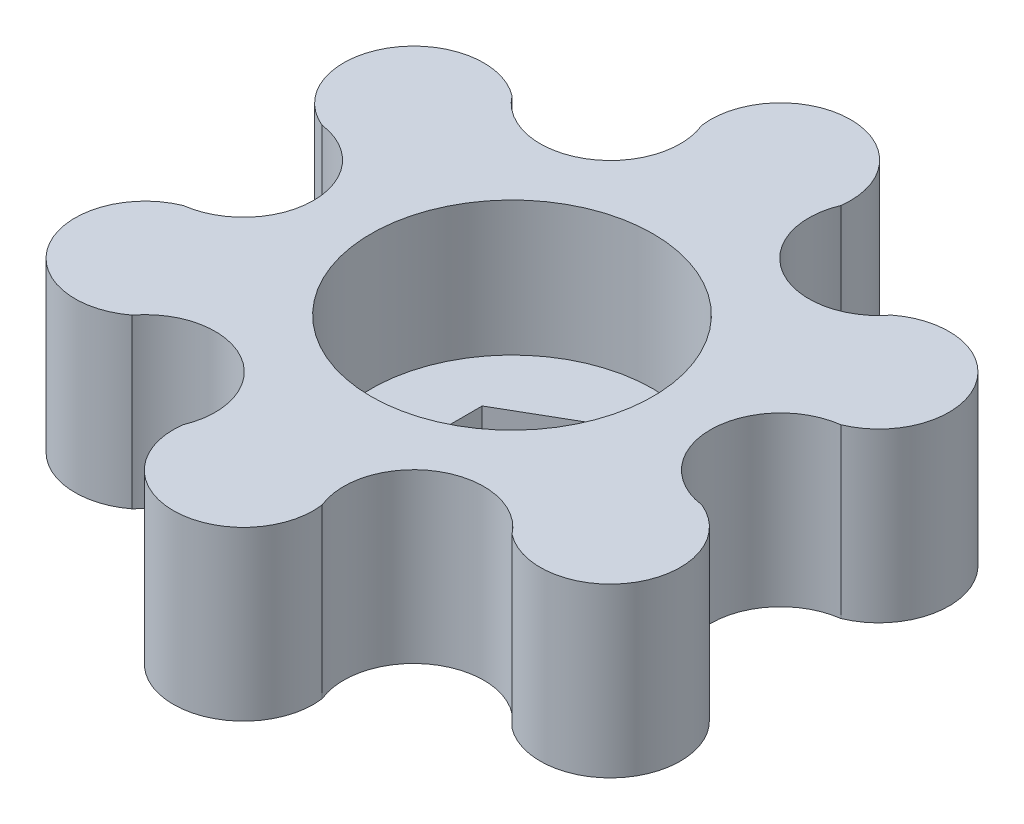
ISO-10303-21;
HEADER;
FILE_DESCRIPTION(('STEP AP214'),'2;1');
FILE_NAME('part.step','',(''),(''),'','','');
FILE_SCHEMA(('AUTOMOTIVE_DESIGN { 1 0 10303 214 1 1 1 1 }'));
ENDSEC;
DATA;
#1=APPLICATION_CONTEXT('core data for automotive mechanical design processes');
#2=APPLICATION_PROTOCOL_DEFINITION('international standard','automotive_design',2000,#1);
#3=PRODUCT_CONTEXT('',#1,'mechanical');
#4=PRODUCT('Part','Part','',(#3));
#5=PRODUCT_RELATED_PRODUCT_CATEGORY('part','',(#4));
#6=PRODUCT_DEFINITION_FORMATION('','',#4);
#7=PRODUCT_DEFINITION_CONTEXT('part definition',#1,'design');
#8=PRODUCT_DEFINITION('design','',#6,#7);
#9=PRODUCT_DEFINITION_SHAPE('','',#8);
#10=(LENGTH_UNIT() NAMED_UNIT(*) SI_UNIT(.MILLI.,.METRE.));
#11=(NAMED_UNIT(*) PLANE_ANGLE_UNIT() SI_UNIT($,.RADIAN.));
#12=(NAMED_UNIT(*) SI_UNIT($,.STERADIAN.) SOLID_ANGLE_UNIT());
#13=UNCERTAINTY_MEASURE_WITH_UNIT(LENGTH_MEASURE(1.E-05),#10,'distance_accuracy_value','');
#14=(GEOMETRIC_REPRESENTATION_CONTEXT(3) GLOBAL_UNCERTAINTY_ASSIGNED_CONTEXT((#13)) GLOBAL_UNIT_ASSIGNED_CONTEXT((#10,
#11,#12)) REPRESENTATION_CONTEXT('',''));
#15=CARTESIAN_POINT('',(0.,0.,0.));
#16=DIRECTION('',(0.,0.,1.));
#17=DIRECTION('',(1.,0.,0.));
#18=AXIS2_PLACEMENT_3D('',#15,#16,#17);
#19=CARTESIAN_POINT('',(0.,5.,0.));
#20=DIRECTION('',(0.,-1.,0.));
#21=DIRECTION('',(0.,0.,-1.));
#22=AXIS2_PLACEMENT_3D('',#19,#20,#21);
#23=CYLINDRICAL_SURFACE('',#22,4.2);
#24=CARTESIAN_POINT('',(0.,5.,0.));
#25=DIRECTION('',(0.,1.,0.));
#26=DIRECTION('',(0.,0.,1.));
#27=AXIS2_PLACEMENT_3D('',#24,#25,#26);
#28=CIRCLE('',#27,4.2);
#29=CARTESIAN_POINT('',(0.,5.,4.2));
#30=VERTEX_POINT('',#29);
#31=EDGE_CURVE('E162',#30,#30,#28,.T.);
#32=ORIENTED_EDGE('',*,*,#31,.T.);
#33=EDGE_LOOP('',(#32));
#34=FACE_BOUND('',#33,.T.);
#35=CARTESIAN_POINT('',(0.,1.,0.));
#36=DIRECTION('',(0.,-1.,0.));
#37=DIRECTION('',(0.,0.,-1.));
#38=AXIS2_PLACEMENT_3D('',#35,#36,#37);
#39=CIRCLE('',#38,4.2);
#40=CARTESIAN_POINT('',(0.,1.,-4.2));
#41=VERTEX_POINT('',#40);
#42=EDGE_CURVE('E431',#41,#41,#39,.T.);
#43=ORIENTED_EDGE('',*,*,#42,.T.);
#44=EDGE_LOOP('',(#43));
#45=FACE_BOUND('',#44,.T.);
#46=ADVANCED_FACE('F33',(#34,#45),#23,.F.);
#47=CARTESIAN_POINT('',(-2.,5.,-7.46410161513775));
#48=DIRECTION('',(0.,1.,0.));
#49=DIRECTION('',(0.,0.,1.));
#50=AXIS2_PLACEMENT_3D('',#47,#48,#49);
#51=PLANE('',#50);
#52=CARTESIAN_POINT('',(-4.00000000000001,5.,-6.92820323027551));
#53=DIRECTION('',(0.,-1.,0.));
#54=DIRECTION('',(0.,0.,1.));
#55=AXIS2_PLACEMENT_3D('',#52,#53,#54);
#56=CIRCLE('',#55,2.08841907552083);
#57=CARTESIAN_POINT('',(-2.07055236082017,5.,-7.72740661031255));
#58=VERTEX_POINT('',#57);
#59=CARTESIAN_POINT('',(-5.65685424949238,5.,-5.65685424949237));
#60=VERTEX_POINT('',#59);
#61=EDGE_CURVE('E181',#58,#60,#56,.T.);
#62=ORIENTED_EDGE('',*,*,#61,.T.);
#63=CARTESIAN_POINT('',(-6.92820323027551,5.,-3.99999999999999));
#64=DIRECTION('',(0.,1.,0.));
#65=DIRECTION('',(0.,0.,1.));
#66=AXIS2_PLACEMENT_3D('',#63,#64,#65);
#67=CIRCLE('',#66,2.08841907552082);
#68=CARTESIAN_POINT('',(-7.72740661031255,5.,-2.07055236082016));
#69=VERTEX_POINT('',#68);
#70=EDGE_CURVE('E106',#60,#69,#67,.T.);
#71=ORIENTED_EDGE('',*,*,#70,.T.);
#72=CARTESIAN_POINT('',(-8.,5.,0.));
#73=DIRECTION('',(0.,-1.,0.));
#74=DIRECTION('',(0.,0.,1.));
#75=AXIS2_PLACEMENT_3D('',#72,#73,#74);
#76=CIRCLE('',#75,2.08841907552083);
#77=CARTESIAN_POINT('',(-7.72740661031255,5.,2.07055236082017));
#78=VERTEX_POINT('',#77);
#79=EDGE_CURVE('E208',#69,#78,#76,.T.);
#80=ORIENTED_EDGE('',*,*,#79,.T.);
#81=CARTESIAN_POINT('',(-6.9282032302755,5.,4.));
#82=DIRECTION('',(0.,1.,0.));
#83=DIRECTION('',(0.,0.,1.));
#84=AXIS2_PLACEMENT_3D('',#81,#82,#83);
#85=CIRCLE('',#84,2.08841907552083);
#86=CARTESIAN_POINT('',(-5.65685424949238,5.,5.65685424949238));
#87=VERTEX_POINT('',#86);
#88=EDGE_CURVE('E227',#78,#87,#85,.T.);
#89=ORIENTED_EDGE('',*,*,#88,.T.);
#90=CARTESIAN_POINT('',(-4.,5.,6.92820323027551));
#91=DIRECTION('',(0.,-1.,0.));
#92=DIRECTION('',(0.,0.,1.));
#93=AXIS2_PLACEMENT_3D('',#90,#91,#92);
#94=CIRCLE('',#93,2.08841907552082);
#95=CARTESIAN_POINT('',(-2.07055236082016,5.,7.72740661031254));
#96=VERTEX_POINT('',#95);
#97=EDGE_CURVE('E224',#87,#96,#94,.T.);
#98=ORIENTED_EDGE('',*,*,#97,.T.);
#99=CARTESIAN_POINT('',(0.,5.,8.));
#100=DIRECTION('',(0.,1.,0.));
#101=DIRECTION('',(0.,0.,1.));
#102=AXIS2_PLACEMENT_3D('',#99,#100,#101);
#103=CIRCLE('',#102,2.08841907552083);
#104=CARTESIAN_POINT('',(2.07055236082017,5.,7.72740661031254));
#105=VERTEX_POINT('',#104);
#106=EDGE_CURVE('E226',#96,#105,#103,.T.);
#107=ORIENTED_EDGE('',*,*,#106,.T.);
#108=CARTESIAN_POINT('',(4.,5.,6.92820323027551));
#109=DIRECTION('',(0.,-1.,0.));
#110=DIRECTION('',(0.,0.,1.));
#111=AXIS2_PLACEMENT_3D('',#108,#109,#110);
#112=CIRCLE('',#111,2.08841907552083);
#113=CARTESIAN_POINT('',(5.65685424949238,5.,5.65685424949238));
#114=VERTEX_POINT('',#113);
#115=EDGE_CURVE('E229',#105,#114,#112,.T.);
#116=ORIENTED_EDGE('',*,*,#115,.T.);
#117=CARTESIAN_POINT('',(6.92820323027551,5.,4.));
#118=DIRECTION('',(0.,1.,0.));
#119=DIRECTION('',(0.,0.,1.));
#120=AXIS2_PLACEMENT_3D('',#117,#118,#119);
#121=CIRCLE('',#120,2.08841907552083);
#122=CARTESIAN_POINT('',(7.72740661031255,5.,2.07055236082016));
#123=VERTEX_POINT('',#122);
#124=EDGE_CURVE('E235',#114,#123,#121,.T.);
#125=ORIENTED_EDGE('',*,*,#124,.T.);
#126=CARTESIAN_POINT('',(8.,5.,0.));
#127=DIRECTION('',(0.,-1.,0.));
#128=DIRECTION('',(0.,0.,1.));
#129=AXIS2_PLACEMENT_3D('',#126,#127,#128);
#130=CIRCLE('',#129,2.08841907552082);
#131=CARTESIAN_POINT('',(7.72740661031255,5.,-2.07055236082017));
#132=VERTEX_POINT('',#131);
#133=EDGE_CURVE('E140',#123,#132,#130,.T.);
#134=ORIENTED_EDGE('',*,*,#133,.T.);
#135=CARTESIAN_POINT('',(6.92820323027551,5.,-4.));
#136=DIRECTION('',(0.,1.,0.));
#137=DIRECTION('',(0.,0.,1.));
#138=AXIS2_PLACEMENT_3D('',#135,#136,#137);
#139=CIRCLE('',#138,2.08841907552083);
#140=CARTESIAN_POINT('',(5.65685424949238,5.,-5.65685424949238));
#141=VERTEX_POINT('',#140);
#142=EDGE_CURVE('E133',#132,#141,#139,.T.);
#143=ORIENTED_EDGE('',*,*,#142,.T.);
#144=CARTESIAN_POINT('',(4.,5.,-6.92820323027551));
#145=DIRECTION('',(0.,-1.,0.));
#146=DIRECTION('',(0.,0.,1.));
#147=AXIS2_PLACEMENT_3D('',#144,#145,#146);
#148=CIRCLE('',#147,2.08841907552082);
#149=CARTESIAN_POINT('',(2.07055236082017,5.,-7.72740661031254));
#150=VERTEX_POINT('',#149);
#151=EDGE_CURVE('E138',#141,#150,#148,.T.);
#152=ORIENTED_EDGE('',*,*,#151,.T.);
#153=CARTESIAN_POINT('',(0.,5.,-8.));
#154=DIRECTION('',(0.,1.,0.));
#155=DIRECTION('',(0.,0.,1.));
#156=AXIS2_PLACEMENT_3D('',#153,#154,#155);
#157=CIRCLE('',#156,2.08841907552083);
#158=EDGE_CURVE('E50',#150,#58,#157,.T.);
#159=ORIENTED_EDGE('',*,*,#158,.T.);
#160=EDGE_LOOP('',(#62,#71,#80,#89,#98,#107,#116,#125,#134,#143,#152,#159));
#161=FACE_BOUND('',#160,.T.);
#162=ORIENTED_EDGE('',*,*,#31,.F.);
#163=EDGE_LOOP('',(#162));
#164=FACE_BOUND('',#163,.T.);
#165=ADVANCED_FACE('F135',(#161,#164),#51,.T.);
#166=CARTESIAN_POINT('',(-2.,0.,-7.46410161513775));
#167=DIRECTION('',(0.,1.,0.));
#168=DIRECTION('',(0.,0.,1.));
#169=AXIS2_PLACEMENT_3D('',#166,#167,#168);
#170=PLANE('',#169);
#171=CARTESIAN_POINT('',(-4.00000000000001,0.,-6.92820323027551));
#172=DIRECTION('',(0.,-1.,0.));
#173=DIRECTION('',(0.,0.,1.));
#174=AXIS2_PLACEMENT_3D('',#171,#172,#173);
#175=CIRCLE('',#174,2.08841907552083);
#176=CARTESIAN_POINT('',(-2.07055236082017,0.,-7.72740661031255));
#177=VERTEX_POINT('',#176);
#178=CARTESIAN_POINT('',(-5.65685424949238,0.,-5.65685424949237));
#179=VERTEX_POINT('',#178);
#180=EDGE_CURVE('E158',#177,#179,#175,.T.);
#181=ORIENTED_EDGE('',*,*,#180,.F.);
#182=CARTESIAN_POINT('',(0.,0.,-8.));
#183=DIRECTION('',(0.,1.,0.));
#184=DIRECTION('',(0.,0.,1.));
#185=AXIS2_PLACEMENT_3D('',#182,#183,#184);
#186=CIRCLE('',#185,2.08841907552083);
#187=CARTESIAN_POINT('',(2.07055236082017,0.,-7.72740661031254));
#188=VERTEX_POINT('',#187);
#189=EDGE_CURVE('E98',#188,#177,#186,.T.);
#190=ORIENTED_EDGE('',*,*,#189,.F.);
#191=CARTESIAN_POINT('',(4.,0.,-6.92820323027551));
#192=DIRECTION('',(0.,-1.,0.));
#193=DIRECTION('',(0.,0.,1.));
#194=AXIS2_PLACEMENT_3D('',#191,#192,#193);
#195=CIRCLE('',#194,2.08841907552082);
#196=CARTESIAN_POINT('',(5.65685424949238,0.,-5.65685424949238));
#197=VERTEX_POINT('',#196);
#198=EDGE_CURVE('E92',#197,#188,#195,.T.);
#199=ORIENTED_EDGE('',*,*,#198,.F.);
#200=CARTESIAN_POINT('',(6.92820323027551,0.,-4.));
#201=DIRECTION('',(0.,1.,0.));
#202=DIRECTION('',(0.,0.,1.));
#203=AXIS2_PLACEMENT_3D('',#200,#201,#202);
#204=CIRCLE('',#203,2.08841907552083);
#205=CARTESIAN_POINT('',(7.72740661031255,0.,-2.07055236082017));
#206=VERTEX_POINT('',#205);
#207=EDGE_CURVE('E148',#206,#197,#204,.T.);
#208=ORIENTED_EDGE('',*,*,#207,.F.);
#209=CARTESIAN_POINT('',(8.,0.,0.));
#210=DIRECTION('',(0.,-1.,0.));
#211=DIRECTION('',(0.,0.,1.));
#212=AXIS2_PLACEMENT_3D('',#209,#210,#211);
#213=CIRCLE('',#212,2.08841907552082);
#214=CARTESIAN_POINT('',(7.72740661031255,0.,2.07055236082016));
#215=VERTEX_POINT('',#214);
#216=EDGE_CURVE('E176',#215,#206,#213,.T.);
#217=ORIENTED_EDGE('',*,*,#216,.F.);
#218=CARTESIAN_POINT('',(6.92820323027551,0.,4.));
#219=DIRECTION('',(0.,1.,0.));
#220=DIRECTION('',(0.,0.,1.));
#221=AXIS2_PLACEMENT_3D('',#218,#219,#220);
#222=CIRCLE('',#221,2.08841907552083);
#223=CARTESIAN_POINT('',(5.65685424949238,0.,5.65685424949238));
#224=VERTEX_POINT('',#223);
#225=EDGE_CURVE('E174',#224,#215,#222,.T.);
#226=ORIENTED_EDGE('',*,*,#225,.F.);
#227=CARTESIAN_POINT('',(4.,0.,6.92820323027551));
#228=DIRECTION('',(0.,-1.,0.));
#229=DIRECTION('',(0.,0.,1.));
#230=AXIS2_PLACEMENT_3D('',#227,#228,#229);
#231=CIRCLE('',#230,2.08841907552083);
#232=CARTESIAN_POINT('',(2.07055236082017,0.,7.72740661031254));
#233=VERTEX_POINT('',#232);
#234=EDGE_CURVE('E172',#233,#224,#231,.T.);
#235=ORIENTED_EDGE('',*,*,#234,.F.);
#236=CARTESIAN_POINT('',(0.,0.,8.));
#237=DIRECTION('',(0.,1.,0.));
#238=DIRECTION('',(0.,0.,1.));
#239=AXIS2_PLACEMENT_3D('',#236,#237,#238);
#240=CIRCLE('',#239,2.08841907552083);
#241=CARTESIAN_POINT('',(-2.07055236082016,0.,7.72740661031254));
#242=VERTEX_POINT('',#241);
#243=EDGE_CURVE('E170',#242,#233,#240,.T.);
#244=ORIENTED_EDGE('',*,*,#243,.F.);
#245=CARTESIAN_POINT('',(-4.,0.,6.92820323027551));
#246=DIRECTION('',(0.,-1.,0.));
#247=DIRECTION('',(0.,0.,1.));
#248=AXIS2_PLACEMENT_3D('',#245,#246,#247);
#249=CIRCLE('',#248,2.08841907552082);
#250=CARTESIAN_POINT('',(-5.65685424949238,0.,5.65685424949238));
#251=VERTEX_POINT('',#250);
#252=EDGE_CURVE('E168',#251,#242,#249,.T.);
#253=ORIENTED_EDGE('',*,*,#252,.F.);
#254=CARTESIAN_POINT('',(-6.9282032302755,0.,4.));
#255=DIRECTION('',(0.,1.,0.));
#256=DIRECTION('',(0.,0.,1.));
#257=AXIS2_PLACEMENT_3D('',#254,#255,#256);
#258=CIRCLE('',#257,2.08841907552083);
#259=CARTESIAN_POINT('',(-7.72740661031255,0.,2.07055236082017));
#260=VERTEX_POINT('',#259);
#261=EDGE_CURVE('E166',#260,#251,#258,.T.);
#262=ORIENTED_EDGE('',*,*,#261,.F.);
#263=CARTESIAN_POINT('',(-8.,0.,0.));
#264=DIRECTION('',(0.,-1.,0.));
#265=DIRECTION('',(0.,0.,1.));
#266=AXIS2_PLACEMENT_3D('',#263,#264,#265);
#267=CIRCLE('',#266,2.08841907552083);
#268=CARTESIAN_POINT('',(-7.72740661031255,0.,-2.07055236082016));
#269=VERTEX_POINT('',#268);
#270=EDGE_CURVE('E164',#269,#260,#267,.T.);
#271=ORIENTED_EDGE('',*,*,#270,.F.);
#272=CARTESIAN_POINT('',(-6.92820323027551,0.,-3.99999999999999));
#273=DIRECTION('',(0.,1.,0.));
#274=DIRECTION('',(0.,0.,1.));
#275=AXIS2_PLACEMENT_3D('',#272,#273,#274);
#276=CIRCLE('',#275,2.08841907552082);
#277=EDGE_CURVE('E161',#179,#269,#276,.T.);
#278=ORIENTED_EDGE('',*,*,#277,.F.);
#279=EDGE_LOOP('',(#181,#190,#199,#208,#217,#226,#235,#244,#253,#262,#271,#278));
#280=FACE_BOUND('',#279,.T.);
#281=DIRECTION('',(-0.866025403784439,0.,0.5));
#282=VECTOR('',#281,1.);
#283=CARTESIAN_POINT('',(2.1,0.,1.21243556529821));
#284=LINE('',#283,#282);
#285=CARTESIAN_POINT('',(2.1,0.,1.21243556529821));
#286=VERTEX_POINT('',#285);
#287=CARTESIAN_POINT('',(0.,0.,2.42487113059643));
#288=VERTEX_POINT('',#287);
#289=EDGE_CURVE('E409',#286,#288,#284,.T.);
#290=ORIENTED_EDGE('',*,*,#289,.F.);
#291=DIRECTION('',(0.,0.,1.));
#292=VECTOR('',#291,1.);
#293=CARTESIAN_POINT('',(2.1,0.,-1.21243556529822));
#294=LINE('',#293,#292);
#295=CARTESIAN_POINT('',(2.1,0.,-1.21243556529822));
#296=VERTEX_POINT('',#295);
#297=EDGE_CURVE('E424',#296,#286,#294,.T.);
#298=ORIENTED_EDGE('',*,*,#297,.F.);
#299=DIRECTION('',(0.866025403784439,0.,0.5));
#300=VECTOR('',#299,1.);
#301=CARTESIAN_POINT('',(0.,0.,-2.42487113059643));
#302=LINE('',#301,#300);
#303=CARTESIAN_POINT('',(0.,0.,-2.42487113059643));
#304=VERTEX_POINT('',#303);
#305=EDGE_CURVE('E418',#304,#296,#302,.T.);
#306=ORIENTED_EDGE('',*,*,#305,.F.);
#307=DIRECTION('',(0.866025403784439,0.,-0.5));
#308=VECTOR('',#307,1.);
#309=CARTESIAN_POINT('',(-2.1,0.,-1.21243556529821));
#310=LINE('',#309,#308);
#311=CARTESIAN_POINT('',(-2.1,0.,-1.21243556529821));
#312=VERTEX_POINT('',#311);
#313=EDGE_CURVE('E415',#312,#304,#310,.T.);
#314=ORIENTED_EDGE('',*,*,#313,.F.);
#315=DIRECTION('',(0.,0.,-1.));
#316=VECTOR('',#315,1.);
#317=CARTESIAN_POINT('',(-2.1,0.,1.21243556529821));
#318=LINE('',#317,#316);
#319=CARTESIAN_POINT('',(-2.1,0.,1.21243556529821));
#320=VERTEX_POINT('',#319);
#321=EDGE_CURVE('E408',#320,#312,#318,.T.);
#322=ORIENTED_EDGE('',*,*,#321,.F.);
#323=DIRECTION('',(-0.866025403784439,0.,-0.5));
#324=VECTOR('',#323,1.);
#325=CARTESIAN_POINT('',(0.,0.,2.42487113059643));
#326=LINE('',#325,#324);
#327=EDGE_CURVE('E396',#288,#320,#326,.T.);
#328=ORIENTED_EDGE('',*,*,#327,.F.);
#329=EDGE_LOOP('',(#290,#298,#306,#314,#322,#328));
#330=FACE_BOUND('',#329,.T.);
#331=ADVANCED_FACE('F212',(#280,#330),#170,.F.);
#332=CARTESIAN_POINT('',(-4.00000000000001,5.,-6.92820323027551));
#333=DIRECTION('',(0.,-1.,0.));
#334=DIRECTION('',(0.,0.,-1.));
#335=AXIS2_PLACEMENT_3D('',#332,#333,#334);
#336=CYLINDRICAL_SURFACE('',#335,2.08841907552083);
#337=ORIENTED_EDGE('',*,*,#180,.T.);
#338=DIRECTION('',(0.,-1.,0.));
#339=VECTOR('',#338,1.);
#340=CARTESIAN_POINT('',(-5.65685424949238,5.,-5.65685424949237));
#341=LINE('',#340,#339);
#342=EDGE_CURVE('E11',#60,#179,#341,.T.);
#343=ORIENTED_EDGE('',*,*,#342,.F.);
#344=ORIENTED_EDGE('',*,*,#61,.F.);
#345=DIRECTION('',(0.,-1.,0.));
#346=VECTOR('',#345,1.);
#347=CARTESIAN_POINT('',(-2.07055236082017,5.,-7.72740661031255));
#348=LINE('',#347,#346);
#349=EDGE_CURVE('E154',#58,#177,#348,.T.);
#350=ORIENTED_EDGE('',*,*,#349,.T.);
#351=EDGE_LOOP('',(#337,#343,#344,#350));
#352=FACE_BOUND('',#351,.T.);
#353=ADVANCED_FACE('F35',(#352),#336,.F.);
#354=CARTESIAN_POINT('',(-6.92820323027551,5.,-3.99999999999999));
#355=DIRECTION('',(0.,-1.,0.));
#356=DIRECTION('',(0.,0.,-1.));
#357=AXIS2_PLACEMENT_3D('',#354,#355,#356);
#358=CYLINDRICAL_SURFACE('',#357,2.08841907552082);
#359=ORIENTED_EDGE('',*,*,#277,.T.);
#360=DIRECTION('',(0.,-1.,0.));
#361=VECTOR('',#360,1.);
#362=CARTESIAN_POINT('',(-7.72740661031255,5.,-2.07055236082016));
#363=LINE('',#362,#361);
#364=EDGE_CURVE('E42',#69,#269,#363,.T.);
#365=ORIENTED_EDGE('',*,*,#364,.F.);
#366=ORIENTED_EDGE('',*,*,#70,.F.);
#367=ORIENTED_EDGE('',*,*,#342,.T.);
#368=EDGE_LOOP('',(#359,#365,#366,#367));
#369=FACE_BOUND('',#368,.T.);
#370=ADVANCED_FACE('F276',(#369),#358,.T.);
#371=CARTESIAN_POINT('',(-8.,5.,0.));
#372=DIRECTION('',(0.,-1.,0.));
#373=DIRECTION('',(0.,0.,-1.));
#374=AXIS2_PLACEMENT_3D('',#371,#372,#373);
#375=CYLINDRICAL_SURFACE('',#374,2.08841907552083);
#376=ORIENTED_EDGE('',*,*,#270,.T.);
#377=DIRECTION('',(0.,-1.,0.));
#378=VECTOR('',#377,1.);
#379=CARTESIAN_POINT('',(-7.72740661031255,5.,2.07055236082017));
#380=LINE('',#379,#378);
#381=EDGE_CURVE('E200',#78,#260,#380,.T.);
#382=ORIENTED_EDGE('',*,*,#381,.F.);
#383=ORIENTED_EDGE('',*,*,#79,.F.);
#384=ORIENTED_EDGE('',*,*,#364,.T.);
#385=EDGE_LOOP('',(#376,#382,#383,#384));
#386=FACE_BOUND('',#385,.T.);
#387=ADVANCED_FACE('F206',(#386),#375,.F.);
#388=CARTESIAN_POINT('',(-6.9282032302755,5.,4.));
#389=DIRECTION('',(0.,-1.,0.));
#390=DIRECTION('',(0.,0.,-1.));
#391=AXIS2_PLACEMENT_3D('',#388,#389,#390);
#392=CYLINDRICAL_SURFACE('',#391,2.08841907552083);
#393=ORIENTED_EDGE('',*,*,#261,.T.);
#394=DIRECTION('',(0.,-1.,0.));
#395=VECTOR('',#394,1.);
#396=CARTESIAN_POINT('',(-5.65685424949238,5.,5.65685424949238));
#397=LINE('',#396,#395);
#398=EDGE_CURVE('E197',#87,#251,#397,.T.);
#399=ORIENTED_EDGE('',*,*,#398,.F.);
#400=ORIENTED_EDGE('',*,*,#88,.F.);
#401=ORIENTED_EDGE('',*,*,#381,.T.);
#402=EDGE_LOOP('',(#393,#399,#400,#401));
#403=FACE_BOUND('',#402,.T.);
#404=ADVANCED_FACE('F218',(#403),#392,.T.);
#405=CARTESIAN_POINT('',(-4.,5.,6.92820323027551));
#406=DIRECTION('',(0.,-1.,0.));
#407=DIRECTION('',(0.,0.,-1.));
#408=AXIS2_PLACEMENT_3D('',#405,#406,#407);
#409=CYLINDRICAL_SURFACE('',#408,2.08841907552082);
#410=ORIENTED_EDGE('',*,*,#252,.T.);
#411=DIRECTION('',(0.,-1.,0.));
#412=VECTOR('',#411,1.);
#413=CARTESIAN_POINT('',(-2.07055236082016,5.,7.72740661031254));
#414=LINE('',#413,#412);
#415=EDGE_CURVE('E194',#96,#242,#414,.T.);
#416=ORIENTED_EDGE('',*,*,#415,.F.);
#417=ORIENTED_EDGE('',*,*,#97,.F.);
#418=ORIENTED_EDGE('',*,*,#398,.T.);
#419=EDGE_LOOP('',(#410,#416,#417,#418));
#420=FACE_BOUND('',#419,.T.);
#421=ADVANCED_FACE('F222',(#420),#409,.F.);
#422=CARTESIAN_POINT('',(0.,5.,8.));
#423=DIRECTION('',(0.,-1.,0.));
#424=DIRECTION('',(0.,0.,-1.));
#425=AXIS2_PLACEMENT_3D('',#422,#423,#424);
#426=CYLINDRICAL_SURFACE('',#425,2.08841907552083);
#427=ORIENTED_EDGE('',*,*,#243,.T.);
#428=DIRECTION('',(0.,-1.,0.));
#429=VECTOR('',#428,1.);
#430=CARTESIAN_POINT('',(2.07055236082017,5.,7.72740661031254));
#431=LINE('',#430,#429);
#432=EDGE_CURVE('E191',#105,#233,#431,.T.);
#433=ORIENTED_EDGE('',*,*,#432,.F.);
#434=ORIENTED_EDGE('',*,*,#106,.F.);
#435=ORIENTED_EDGE('',*,*,#415,.T.);
#436=EDGE_LOOP('',(#427,#433,#434,#435));
#437=FACE_BOUND('',#436,.T.);
#438=ADVANCED_FACE('F289',(#437),#426,.T.);
#439=CARTESIAN_POINT('',(4.,5.,6.92820323027551));
#440=DIRECTION('',(0.,-1.,0.));
#441=DIRECTION('',(0.,0.,-1.));
#442=AXIS2_PLACEMENT_3D('',#439,#440,#441);
#443=CYLINDRICAL_SURFACE('',#442,2.08841907552083);
#444=ORIENTED_EDGE('',*,*,#234,.T.);
#445=DIRECTION('',(0.,-1.,0.));
#446=VECTOR('',#445,1.);
#447=CARTESIAN_POINT('',(5.65685424949238,5.,5.65685424949238));
#448=LINE('',#447,#446);
#449=EDGE_CURVE('E188',#114,#224,#448,.T.);
#450=ORIENTED_EDGE('',*,*,#449,.F.);
#451=ORIENTED_EDGE('',*,*,#115,.F.);
#452=ORIENTED_EDGE('',*,*,#432,.T.);
#453=EDGE_LOOP('',(#444,#450,#451,#452));
#454=FACE_BOUND('',#453,.T.);
#455=ADVANCED_FACE('F292',(#454),#443,.F.);
#456=CARTESIAN_POINT('',(6.92820323027551,5.,4.));
#457=DIRECTION('',(0.,-1.,0.));
#458=DIRECTION('',(0.,0.,-1.));
#459=AXIS2_PLACEMENT_3D('',#456,#457,#458);
#460=CYLINDRICAL_SURFACE('',#459,2.08841907552083);
#461=ORIENTED_EDGE('',*,*,#225,.T.);
#462=DIRECTION('',(0.,-1.,0.));
#463=VECTOR('',#462,1.);
#464=CARTESIAN_POINT('',(7.72740661031255,5.,2.07055236082016));
#465=LINE('',#464,#463);
#466=EDGE_CURVE('E185',#123,#215,#465,.T.);
#467=ORIENTED_EDGE('',*,*,#466,.F.);
#468=ORIENTED_EDGE('',*,*,#124,.F.);
#469=ORIENTED_EDGE('',*,*,#449,.T.);
#470=EDGE_LOOP('',(#461,#467,#468,#469));
#471=FACE_BOUND('',#470,.T.);
#472=ADVANCED_FACE('F241',(#471),#460,.T.);
#473=CARTESIAN_POINT('',(8.,5.,0.));
#474=DIRECTION('',(0.,-1.,0.));
#475=DIRECTION('',(0.,0.,-1.));
#476=AXIS2_PLACEMENT_3D('',#473,#474,#475);
#477=CYLINDRICAL_SURFACE('',#476,2.08841907552082);
#478=ORIENTED_EDGE('',*,*,#216,.T.);
#479=DIRECTION('',(0.,-1.,0.));
#480=VECTOR('',#479,1.);
#481=CARTESIAN_POINT('',(7.72740661031255,5.,-2.07055236082017));
#482=LINE('',#481,#480);
#483=EDGE_CURVE('E149',#132,#206,#482,.T.);
#484=ORIENTED_EDGE('',*,*,#483,.F.);
#485=ORIENTED_EDGE('',*,*,#133,.F.);
#486=ORIENTED_EDGE('',*,*,#466,.T.);
#487=EDGE_LOOP('',(#478,#484,#485,#486));
#488=FACE_BOUND('',#487,.T.);
#489=ADVANCED_FACE('F245',(#488),#477,.F.);
#490=CARTESIAN_POINT('',(6.92820323027551,5.,-4.));
#491=DIRECTION('',(0.,-1.,0.));
#492=DIRECTION('',(0.,0.,-1.));
#493=AXIS2_PLACEMENT_3D('',#490,#491,#492);
#494=CYLINDRICAL_SURFACE('',#493,2.08841907552083);
#495=ORIENTED_EDGE('',*,*,#207,.T.);
#496=DIRECTION('',(0.,-1.,0.));
#497=VECTOR('',#496,1.);
#498=CARTESIAN_POINT('',(5.65685424949238,5.,-5.65685424949238));
#499=LINE('',#498,#497);
#500=EDGE_CURVE('E145',#141,#197,#499,.T.);
#501=ORIENTED_EDGE('',*,*,#500,.F.);
#502=ORIENTED_EDGE('',*,*,#142,.F.);
#503=ORIENTED_EDGE('',*,*,#483,.T.);
#504=EDGE_LOOP('',(#495,#501,#502,#503));
#505=FACE_BOUND('',#504,.T.);
#506=ADVANCED_FACE('F146',(#505),#494,.T.);
#507=CARTESIAN_POINT('',(4.,5.,-6.92820323027551));
#508=DIRECTION('',(0.,-1.,0.));
#509=DIRECTION('',(0.,0.,-1.));
#510=AXIS2_PLACEMENT_3D('',#507,#508,#509);
#511=CYLINDRICAL_SURFACE('',#510,2.08841907552082);
#512=ORIENTED_EDGE('',*,*,#198,.T.);
#513=DIRECTION('',(0.,-1.,0.));
#514=VECTOR('',#513,1.);
#515=CARTESIAN_POINT('',(2.07055236082017,5.,-7.72740661031254));
#516=LINE('',#515,#514);
#517=EDGE_CURVE('E150',#150,#188,#516,.T.);
#518=ORIENTED_EDGE('',*,*,#517,.F.);
#519=ORIENTED_EDGE('',*,*,#151,.F.);
#520=ORIENTED_EDGE('',*,*,#500,.T.);
#521=EDGE_LOOP('',(#512,#518,#519,#520));
#522=FACE_BOUND('',#521,.T.);
#523=ADVANCED_FACE('F152',(#522),#511,.F.);
#524=CARTESIAN_POINT('',(0.,5.,-8.));
#525=DIRECTION('',(0.,-1.,0.));
#526=DIRECTION('',(0.,0.,-1.));
#527=AXIS2_PLACEMENT_3D('',#524,#525,#526);
#528=CYLINDRICAL_SURFACE('',#527,2.08841907552083);
#529=ORIENTED_EDGE('',*,*,#189,.T.);
#530=ORIENTED_EDGE('',*,*,#349,.F.);
#531=ORIENTED_EDGE('',*,*,#158,.F.);
#532=ORIENTED_EDGE('',*,*,#517,.T.);
#533=EDGE_LOOP('',(#529,#530,#531,#532));
#534=FACE_BOUND('',#533,.T.);
#535=ADVANCED_FACE('F249',(#534),#528,.T.);
#536=CARTESIAN_POINT('',(0.,1.,0.));
#537=DIRECTION('',(0.,-1.,0.));
#538=DIRECTION('',(0.,0.,-1.));
#539=AXIS2_PLACEMENT_3D('',#536,#537,#538);
#540=PLANE('',#539);
#541=DIRECTION('',(0.,0.,1.));
#542=VECTOR('',#541,1.);
#543=CARTESIAN_POINT('',(2.1,1.,-1.21243556529822));
#544=LINE('',#543,#542);
#545=CARTESIAN_POINT('',(2.1,1.,-1.21243556529822));
#546=VERTEX_POINT('',#545);
#547=CARTESIAN_POINT('',(2.1,1.,1.21243556529821));
#548=VERTEX_POINT('',#547);
#549=EDGE_CURVE('E443',#546,#548,#544,.T.);
#550=ORIENTED_EDGE('',*,*,#549,.T.);
#551=DIRECTION('',(-0.866025403784439,0.,0.5));
#552=VECTOR('',#551,1.);
#553=CARTESIAN_POINT('',(2.1,1.,1.21243556529821));
#554=LINE('',#553,#552);
#555=CARTESIAN_POINT('',(0.,1.,2.42487113059643));
#556=VERTEX_POINT('',#555);
#557=EDGE_CURVE('E427',#548,#556,#554,.T.);
#558=ORIENTED_EDGE('',*,*,#557,.T.);
#559=DIRECTION('',(-0.866025403784439,0.,-0.5));
#560=VECTOR('',#559,1.);
#561=CARTESIAN_POINT('',(0.,1.,2.42487113059643));
#562=LINE('',#561,#560);
#563=CARTESIAN_POINT('',(-2.1,1.,1.21243556529821));
#564=VERTEX_POINT('',#563);
#565=EDGE_CURVE('E489',#556,#564,#562,.T.);
#566=ORIENTED_EDGE('',*,*,#565,.T.);
#567=DIRECTION('',(0.,0.,-1.));
#568=VECTOR('',#567,1.);
#569=CARTESIAN_POINT('',(-2.1,1.,1.21243556529821));
#570=LINE('',#569,#568);
#571=CARTESIAN_POINT('',(-2.1,1.,-1.21243556529821));
#572=VERTEX_POINT('',#571);
#573=EDGE_CURVE('E486',#564,#572,#570,.T.);
#574=ORIENTED_EDGE('',*,*,#573,.T.);
#575=DIRECTION('',(0.866025403784439,0.,-0.5));
#576=VECTOR('',#575,1.);
#577=CARTESIAN_POINT('',(-2.1,1.,-1.21243556529821));
#578=LINE('',#577,#576);
#579=CARTESIAN_POINT('',(0.,1.,-2.42487113059643));
#580=VERTEX_POINT('',#579);
#581=EDGE_CURVE('E458',#572,#580,#578,.T.);
#582=ORIENTED_EDGE('',*,*,#581,.T.);
#583=DIRECTION('',(0.866025403784439,0.,0.5));
#584=VECTOR('',#583,1.);
#585=CARTESIAN_POINT('',(0.,1.,-2.42487113059643));
#586=LINE('',#585,#584);
#587=EDGE_CURVE('E452',#580,#546,#586,.T.);
#588=ORIENTED_EDGE('',*,*,#587,.T.);
#589=EDGE_LOOP('',(#550,#558,#566,#574,#582,#588));
#590=FACE_BOUND('',#589,.T.);
#591=ORIENTED_EDGE('',*,*,#42,.F.);
#592=EDGE_LOOP('',(#591));
#593=FACE_BOUND('',#592,.T.);
#594=ADVANCED_FACE('F251',(#590,#593),#540,.F.);
#595=CARTESIAN_POINT('',(2.1,1.,1.21243556529821));
#596=DIRECTION('',(0.5,0.,0.866025403784439));
#597=DIRECTION('',(0.866025403784439,0.,-0.5));
#598=AXIS2_PLACEMENT_3D('',#595,#596,#597);
#599=PLANE('',#598);
#600=ORIENTED_EDGE('',*,*,#289,.T.);
#601=DIRECTION('',(0.,-1.,0.));
#602=VECTOR('',#601,1.);
#603=CARTESIAN_POINT('',(0.,1.,2.42487113059643));
#604=LINE('',#603,#602);
#605=EDGE_CURVE('E404',#556,#288,#604,.T.);
#606=ORIENTED_EDGE('',*,*,#605,.F.);
#607=ORIENTED_EDGE('',*,*,#557,.F.);
#608=DIRECTION('',(0.,-1.,0.));
#609=VECTOR('',#608,1.);
#610=CARTESIAN_POINT('',(2.1,1.,1.21243556529821));
#611=LINE('',#610,#609);
#612=EDGE_CURVE('E428',#548,#286,#611,.T.);
#613=ORIENTED_EDGE('',*,*,#612,.T.);
#614=EDGE_LOOP('',(#600,#606,#607,#613));
#615=FACE_BOUND('',#614,.T.);
#616=ADVANCED_FACE('F257',(#615),#599,.F.);
#617=CARTESIAN_POINT('',(2.1,1.,-1.21243556529822));
#618=DIRECTION('',(1.,0.,0.));
#619=DIRECTION('',(0.,0.,-1.));
#620=AXIS2_PLACEMENT_3D('',#617,#618,#619);
#621=PLANE('',#620);
#622=ORIENTED_EDGE('',*,*,#297,.T.);
#623=ORIENTED_EDGE('',*,*,#612,.F.);
#624=ORIENTED_EDGE('',*,*,#549,.F.);
#625=DIRECTION('',(0.,-1.,0.));
#626=VECTOR('',#625,1.);
#627=CARTESIAN_POINT('',(2.1,1.,-1.21243556529822));
#628=LINE('',#627,#626);
#629=EDGE_CURVE('E432',#546,#296,#628,.T.);
#630=ORIENTED_EDGE('',*,*,#629,.T.);
#631=EDGE_LOOP('',(#622,#623,#624,#630));
#632=FACE_BOUND('',#631,.T.);
#633=ADVANCED_FACE('F338',(#632),#621,.F.);
#634=CARTESIAN_POINT('',(0.,1.,-2.42487113059643));
#635=DIRECTION('',(0.5,0.,-0.866025403784439));
#636=DIRECTION('',(-0.866025403784439,0.,-0.5));
#637=AXIS2_PLACEMENT_3D('',#634,#635,#636);
#638=PLANE('',#637);
#639=ORIENTED_EDGE('',*,*,#305,.T.);
#640=ORIENTED_EDGE('',*,*,#629,.F.);
#641=ORIENTED_EDGE('',*,*,#587,.F.);
#642=DIRECTION('',(0.,-1.,0.));
#643=VECTOR('',#642,1.);
#644=CARTESIAN_POINT('',(0.,1.,-2.42487113059643));
#645=LINE('',#644,#643);
#646=EDGE_CURVE('E435',#580,#304,#645,.T.);
#647=ORIENTED_EDGE('',*,*,#646,.T.);
#648=EDGE_LOOP('',(#639,#640,#641,#647));
#649=FACE_BOUND('',#648,.T.);
#650=ADVANCED_FACE('F347',(#649),#638,.F.);
#651=CARTESIAN_POINT('',(-2.1,1.,-1.21243556529821));
#652=DIRECTION('',(-0.5,0.,-0.866025403784438));
#653=DIRECTION('',(-0.866025403784439,0.,0.5));
#654=AXIS2_PLACEMENT_3D('',#651,#652,#653);
#655=PLANE('',#654);
#656=ORIENTED_EDGE('',*,*,#313,.T.);
#657=ORIENTED_EDGE('',*,*,#646,.F.);
#658=ORIENTED_EDGE('',*,*,#581,.F.);
#659=DIRECTION('',(0.,-1.,0.));
#660=VECTOR('',#659,1.);
#661=CARTESIAN_POINT('',(-2.1,1.,-1.21243556529821));
#662=LINE('',#661,#660);
#663=EDGE_CURVE('E438',#572,#312,#662,.T.);
#664=ORIENTED_EDGE('',*,*,#663,.T.);
#665=EDGE_LOOP('',(#656,#657,#658,#664));
#666=FACE_BOUND('',#665,.T.);
#667=ADVANCED_FACE('F357',(#666),#655,.F.);
#668=CARTESIAN_POINT('',(-2.1,1.,1.21243556529821));
#669=DIRECTION('',(-1.,0.,0.));
#670=DIRECTION('',(0.,0.,1.));
#671=AXIS2_PLACEMENT_3D('',#668,#669,#670);
#672=PLANE('',#671);
#673=ORIENTED_EDGE('',*,*,#321,.T.);
#674=ORIENTED_EDGE('',*,*,#663,.F.);
#675=ORIENTED_EDGE('',*,*,#573,.F.);
#676=DIRECTION('',(0.,-1.,0.));
#677=VECTOR('',#676,1.);
#678=CARTESIAN_POINT('',(-2.1,1.,1.21243556529821));
#679=LINE('',#678,#677);
#680=EDGE_CURVE('E400',#564,#320,#679,.T.);
#681=ORIENTED_EDGE('',*,*,#680,.T.);
#682=EDGE_LOOP('',(#673,#674,#675,#681));
#683=FACE_BOUND('',#682,.T.);
#684=ADVANCED_FACE('F367',(#683),#672,.F.);
#685=CARTESIAN_POINT('',(0.,1.,2.42487113059643));
#686=DIRECTION('',(-0.5,0.,0.866025403784439));
#687=DIRECTION('',(0.866025403784439,0.,0.5));
#688=AXIS2_PLACEMENT_3D('',#685,#686,#687);
#689=PLANE('',#688);
#690=ORIENTED_EDGE('',*,*,#327,.T.);
#691=ORIENTED_EDGE('',*,*,#680,.F.);
#692=ORIENTED_EDGE('',*,*,#565,.F.);
#693=ORIENTED_EDGE('',*,*,#605,.T.);
#694=EDGE_LOOP('',(#690,#691,#692,#693));
#695=FACE_BOUND('',#694,.T.);
#696=ADVANCED_FACE('F377',(#695),#689,.F.);
#697=CLOSED_SHELL('',(#46,#165,#331,#353,#370,#387,#404,#421,#438,#455,#472,#489,#506,#523,#535,
#594,#616,#633,#650,#667,#684,#696));
#698=MANIFOLD_SOLID_BREP('B2',#697);
#699=ADVANCED_BREP_SHAPE_REPRESENTATION('',(#18,#698),#14);
#700=SHAPE_DEFINITION_REPRESENTATION(#9,#699);
ENDSEC;
END-ISO-10303-21;
